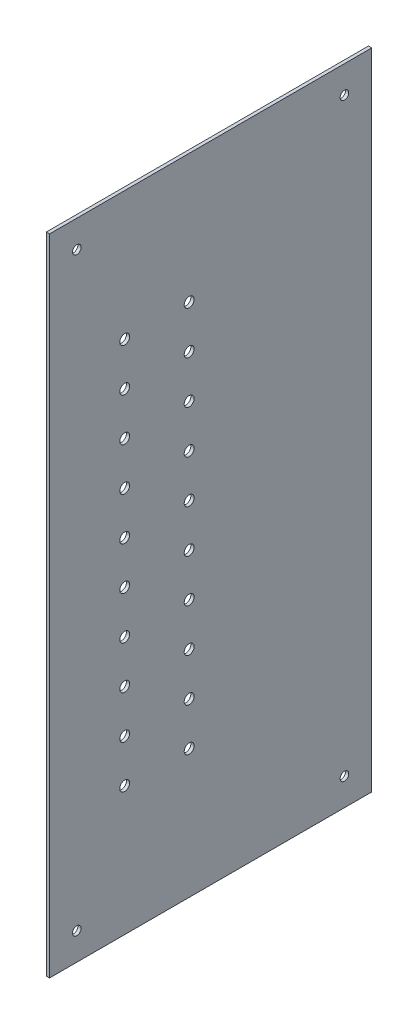
ISO-10303-21;
HEADER;
FILE_DESCRIPTION(('STEP AP214'),'2;1');
FILE_NAME('part.step','',(''),(''),'','','');
FILE_SCHEMA(('AUTOMOTIVE_DESIGN { 1 0 10303 214 1 1 1 1 }'));
ENDSEC;
DATA;
#1=APPLICATION_CONTEXT('core data for automotive mechanical design processes');
#2=APPLICATION_PROTOCOL_DEFINITION('international standard','automotive_design',2000,#1);
#3=PRODUCT_CONTEXT('',#1,'mechanical');
#4=PRODUCT('Part','Part','',(#3));
#5=PRODUCT_RELATED_PRODUCT_CATEGORY('part','',(#4));
#6=PRODUCT_DEFINITION_FORMATION('','',#4);
#7=PRODUCT_DEFINITION_CONTEXT('part definition',#1,'design');
#8=PRODUCT_DEFINITION('design','',#6,#7);
#9=PRODUCT_DEFINITION_SHAPE('','',#8);
#10=(LENGTH_UNIT() NAMED_UNIT(*) SI_UNIT(.MILLI.,.METRE.));
#11=(NAMED_UNIT(*) PLANE_ANGLE_UNIT() SI_UNIT($,.RADIAN.));
#12=(NAMED_UNIT(*) SI_UNIT($,.STERADIAN.) SOLID_ANGLE_UNIT());
#13=UNCERTAINTY_MEASURE_WITH_UNIT(LENGTH_MEASURE(1.E-05),#10,'distance_accuracy_value','');
#14=(GEOMETRIC_REPRESENTATION_CONTEXT(3) GLOBAL_UNCERTAINTY_ASSIGNED_CONTEXT((#13)) GLOBAL_UNIT_ASSIGNED_CONTEXT((#10,
#11,#12)) REPRESENTATION_CONTEXT('',''));
#15=CARTESIAN_POINT('',(0.,0.,0.));
#16=DIRECTION('',(0.,0.,1.));
#17=DIRECTION('',(1.,0.,0.));
#18=AXIS2_PLACEMENT_3D('',#15,#16,#17);
#19=CARTESIAN_POINT('',(0.,0.,0.));
#20=DIRECTION('',(-1.,0.,0.));
#21=DIRECTION('',(0.,0.,1.));
#22=AXIS2_PLACEMENT_3D('',#19,#20,#21);
#23=PLANE('',#22);
#24=CARTESIAN_POINT('',(0.,-90.,9.99999999999999));
#25=DIRECTION('',(1.,0.,0.));
#26=DIRECTION('',(0.,0.,-1.));
#27=AXIS2_PLACEMENT_3D('',#24,#25,#26);
#28=CIRCLE('',#27,2.29999999999998);
#29=CARTESIAN_POINT('',(0.,-90.,7.70000000000001));
#30=VERTEX_POINT('',#29);
#31=EDGE_CURVE('E1882',#30,#30,#28,.T.);
#32=ORIENTED_EDGE('',*,*,#31,.T.);
#33=EDGE_LOOP('',(#32));
#34=FACE_BOUND('',#33,.T.);
#35=CARTESIAN_POINT('',(0.,-70.,10.));
#36=DIRECTION('',(1.,0.,0.));
#37=DIRECTION('',(0.,0.,-1.));
#38=AXIS2_PLACEMENT_3D('',#35,#36,#37);
#39=CIRCLE('',#38,2.29999999999998);
#40=CARTESIAN_POINT('',(0.,-70.,7.70000000000002));
#41=VERTEX_POINT('',#40);
#42=EDGE_CURVE('E1880',#41,#41,#39,.T.);
#43=ORIENTED_EDGE('',*,*,#42,.T.);
#44=EDGE_LOOP('',(#43));
#45=FACE_BOUND('',#44,.T.);
#46=CARTESIAN_POINT('',(0.,-50.,10.));
#47=DIRECTION('',(1.,0.,0.));
#48=DIRECTION('',(0.,0.,-1.));
#49=AXIS2_PLACEMENT_3D('',#46,#47,#48);
#50=CIRCLE('',#49,2.29999999999999);
#51=CARTESIAN_POINT('',(0.,-50.,7.70000000000001));
#52=VERTEX_POINT('',#51);
#53=EDGE_CURVE('E1868',#52,#52,#50,.T.);
#54=ORIENTED_EDGE('',*,*,#53,.T.);
#55=EDGE_LOOP('',(#54));
#56=FACE_BOUND('',#55,.T.);
#57=CARTESIAN_POINT('',(0.,-30.,10.));
#58=DIRECTION('',(1.,0.,0.));
#59=DIRECTION('',(0.,0.,-1.));
#60=AXIS2_PLACEMENT_3D('',#57,#58,#59);
#61=CIRCLE('',#60,2.29999999999999);
#62=CARTESIAN_POINT('',(0.,-30.,7.70000000000002));
#63=VERTEX_POINT('',#62);
#64=EDGE_CURVE('E1861',#63,#63,#61,.T.);
#65=ORIENTED_EDGE('',*,*,#64,.T.);
#66=EDGE_LOOP('',(#65));
#67=FACE_BOUND('',#66,.T.);
#68=CARTESIAN_POINT('',(0.,-9.99999999999999,10.));
#69=DIRECTION('',(1.,0.,0.));
#70=DIRECTION('',(0.,0.,-1.));
#71=AXIS2_PLACEMENT_3D('',#68,#69,#70);
#72=CIRCLE('',#71,2.29999999999999);
#73=CARTESIAN_POINT('',(0.,-9.99999999999999,7.70000000000001));
#74=VERTEX_POINT('',#73);
#75=EDGE_CURVE('E1851',#74,#74,#72,.T.);
#76=ORIENTED_EDGE('',*,*,#75,.T.);
#77=EDGE_LOOP('',(#76));
#78=FACE_BOUND('',#77,.T.);
#79=CARTESIAN_POINT('',(0.,10.,10.));
#80=DIRECTION('',(1.,0.,0.));
#81=DIRECTION('',(0.,0.,-1.));
#82=AXIS2_PLACEMENT_3D('',#79,#80,#81);
#83=CIRCLE('',#82,2.29999999999999);
#84=CARTESIAN_POINT('',(0.,10.,7.70000000000001));
#85=VERTEX_POINT('',#84);
#86=EDGE_CURVE('E1842',#85,#85,#83,.T.);
#87=ORIENTED_EDGE('',*,*,#86,.T.);
#88=EDGE_LOOP('',(#87));
#89=FACE_BOUND('',#88,.T.);
#90=CARTESIAN_POINT('',(0.,30.,10.));
#91=DIRECTION('',(1.,0.,0.));
#92=DIRECTION('',(0.,0.,-1.));
#93=AXIS2_PLACEMENT_3D('',#90,#91,#92);
#94=CIRCLE('',#93,2.29999999999999);
#95=CARTESIAN_POINT('',(0.,30.,7.70000000000001));
#96=VERTEX_POINT('',#95);
#97=EDGE_CURVE('E1840',#96,#96,#94,.T.);
#98=ORIENTED_EDGE('',*,*,#97,.T.);
#99=EDGE_LOOP('',(#98));
#100=FACE_BOUND('',#99,.T.);
#101=CARTESIAN_POINT('',(0.,50.,10.));
#102=DIRECTION('',(1.,0.,0.));
#103=DIRECTION('',(0.,0.,-1.));
#104=AXIS2_PLACEMENT_3D('',#101,#102,#103);
#105=CIRCLE('',#104,2.29999999999999);
#106=CARTESIAN_POINT('',(0.,50.,7.70000000000001));
#107=VERTEX_POINT('',#106);
#108=EDGE_CURVE('E1828',#107,#107,#105,.T.);
#109=ORIENTED_EDGE('',*,*,#108,.T.);
#110=EDGE_LOOP('',(#109));
#111=FACE_BOUND('',#110,.T.);
#112=CARTESIAN_POINT('',(0.,70.,10.));
#113=DIRECTION('',(1.,0.,0.));
#114=DIRECTION('',(0.,0.,-1.));
#115=AXIS2_PLACEMENT_3D('',#112,#113,#114);
#116=CIRCLE('',#115,2.29999999999998);
#117=CARTESIAN_POINT('',(0.,70.,7.70000000000002));
#118=VERTEX_POINT('',#117);
#119=EDGE_CURVE('E1823',#118,#118,#116,.T.);
#120=ORIENTED_EDGE('',*,*,#119,.T.);
#121=EDGE_LOOP('',(#120));
#122=FACE_BOUND('',#121,.T.);
#123=CARTESIAN_POINT('',(0.,90.,10.));
#124=DIRECTION('',(1.,0.,0.));
#125=DIRECTION('',(0.,0.,-1.));
#126=AXIS2_PLACEMENT_3D('',#123,#124,#125);
#127=CIRCLE('',#126,2.29999999999998);
#128=CARTESIAN_POINT('',(0.,90.,7.70000000000002));
#129=VERTEX_POINT('',#128);
#130=EDGE_CURVE('E1812',#129,#129,#127,.T.);
#131=ORIENTED_EDGE('',*,*,#130,.T.);
#132=EDGE_LOOP('',(#131));
#133=FACE_BOUND('',#132,.T.);
#134=CARTESIAN_POINT('',(0.,-90.,40.));
#135=DIRECTION('',(1.,0.,0.));
#136=DIRECTION('',(0.,0.,-1.));
#137=AXIS2_PLACEMENT_3D('',#134,#135,#136);
#138=CIRCLE('',#137,2.3);
#139=CARTESIAN_POINT('',(0.,-90.,37.7));
#140=VERTEX_POINT('',#139);
#141=EDGE_CURVE('E1804',#140,#140,#138,.T.);
#142=ORIENTED_EDGE('',*,*,#141,.T.);
#143=EDGE_LOOP('',(#142));
#144=FACE_BOUND('',#143,.T.);
#145=CARTESIAN_POINT('',(0.,137.3,-62.3));
#146=DIRECTION('',(1.,0.,0.));
#147=DIRECTION('',(0.,0.,-1.));
#148=AXIS2_PLACEMENT_3D('',#145,#146,#147);
#149=CIRCLE('',#148,2.);
#150=CARTESIAN_POINT('',(0.,137.3,-64.3));
#151=VERTEX_POINT('',#150);
#152=EDGE_CURVE('E1723',#151,#151,#149,.T.);
#153=ORIENTED_EDGE('',*,*,#152,.T.);
#154=EDGE_LOOP('',(#153));
#155=FACE_BOUND('',#154,.T.);
#156=CARTESIAN_POINT('',(0.,137.3,62.3));
#157=DIRECTION('',(1.,0.,0.));
#158=DIRECTION('',(0.,0.,-1.));
#159=AXIS2_PLACEMENT_3D('',#156,#157,#158);
#160=CIRCLE('',#159,2.);
#161=CARTESIAN_POINT('',(0.,137.3,60.3));
#162=VERTEX_POINT('',#161);
#163=EDGE_CURVE('E1716',#162,#162,#160,.T.);
#164=ORIENTED_EDGE('',*,*,#163,.T.);
#165=EDGE_LOOP('',(#164));
#166=FACE_BOUND('',#165,.T.);
#167=DIRECTION('',(0.,0.,1.));
#168=VECTOR('',#167,1.);
#169=CARTESIAN_POINT('',(0.,150.,-75.));
#170=LINE('',#169,#168);
#171=CARTESIAN_POINT('',(0.,150.,-75.));
#172=VERTEX_POINT('',#171);
#173=CARTESIAN_POINT('',(0.,150.,75.));
#174=VERTEX_POINT('',#173);
#175=EDGE_CURVE('E1676',#172,#174,#170,.T.);
#176=ORIENTED_EDGE('',*,*,#175,.F.);
#177=DIRECTION('',(0.,1.,0.));
#178=VECTOR('',#177,1.);
#179=CARTESIAN_POINT('',(0.,-150.,-75.));
#180=LINE('',#179,#178);
#181=CARTESIAN_POINT('',(0.,-150.,-75.));
#182=VERTEX_POINT('',#181);
#183=EDGE_CURVE('E1646',#182,#172,#180,.T.);
#184=ORIENTED_EDGE('',*,*,#183,.F.);
#185=DIRECTION('',(0.,0.,-1.));
#186=VECTOR('',#185,1.);
#187=CARTESIAN_POINT('',(0.,-150.,-75.));
#188=LINE('',#187,#186);
#189=CARTESIAN_POINT('',(0.,-150.,75.));
#190=VERTEX_POINT('',#189);
#191=EDGE_CURVE('E1639',#190,#182,#188,.T.);
#192=ORIENTED_EDGE('',*,*,#191,.F.);
#193=DIRECTION('',(0.,-1.,0.));
#194=VECTOR('',#193,1.);
#195=CARTESIAN_POINT('',(0.,-150.,75.));
#196=LINE('',#195,#194);
#197=EDGE_CURVE('E1663',#174,#190,#196,.T.);
#198=ORIENTED_EDGE('',*,*,#197,.F.);
#199=EDGE_LOOP('',(#176,#184,#192,#198));
#200=FACE_BOUND('',#199,.T.);
#201=CARTESIAN_POINT('',(0.,-137.3,62.3));
#202=DIRECTION('',(1.,0.,0.));
#203=DIRECTION('',(0.,0.,-1.));
#204=AXIS2_PLACEMENT_3D('',#201,#202,#203);
#205=CIRCLE('',#204,2.);
#206=CARTESIAN_POINT('',(0.,-137.3,60.3));
#207=VERTEX_POINT('',#206);
#208=EDGE_CURVE('E1683',#207,#207,#205,.T.);
#209=ORIENTED_EDGE('',*,*,#208,.T.);
#210=EDGE_LOOP('',(#209));
#211=FACE_BOUND('',#210,.T.);
#212=CARTESIAN_POINT('',(0.,-137.3,-62.3));
#213=DIRECTION('',(1.,0.,0.));
#214=DIRECTION('',(0.,0.,-1.));
#215=AXIS2_PLACEMENT_3D('',#212,#213,#214);
#216=CIRCLE('',#215,2.);
#217=CARTESIAN_POINT('',(0.,-137.3,-64.3));
#218=VERTEX_POINT('',#217);
#219=EDGE_CURVE('E1706',#218,#218,#216,.T.);
#220=ORIENTED_EDGE('',*,*,#219,.T.);
#221=EDGE_LOOP('',(#220));
#222=FACE_BOUND('',#221,.T.);
#223=CARTESIAN_POINT('',(0.,90.,40.));
#224=DIRECTION('',(1.,0.,0.));
#225=DIRECTION('',(0.,0.,-1.));
#226=AXIS2_PLACEMENT_3D('',#223,#224,#225);
#227=CIRCLE('',#226,2.3);
#228=CARTESIAN_POINT('',(0.,90.,37.7));
#229=VERTEX_POINT('',#228);
#230=EDGE_CURVE('E1735',#229,#229,#227,.T.);
#231=ORIENTED_EDGE('',*,*,#230,.T.);
#232=EDGE_LOOP('',(#231));
#233=FACE_BOUND('',#232,.T.);
#234=CARTESIAN_POINT('',(0.,70.,40.));
#235=DIRECTION('',(1.,0.,0.));
#236=DIRECTION('',(0.,0.,-1.));
#237=AXIS2_PLACEMENT_3D('',#234,#235,#236);
#238=CIRCLE('',#237,2.3);
#239=CARTESIAN_POINT('',(0.,70.,37.7));
#240=VERTEX_POINT('',#239);
#241=EDGE_CURVE('E1743',#240,#240,#238,.T.);
#242=ORIENTED_EDGE('',*,*,#241,.T.);
#243=EDGE_LOOP('',(#242));
#244=FACE_BOUND('',#243,.T.);
#245=CARTESIAN_POINT('',(0.,50.,40.));
#246=DIRECTION('',(1.,0.,0.));
#247=DIRECTION('',(0.,0.,-1.));
#248=AXIS2_PLACEMENT_3D('',#245,#246,#247);
#249=CIRCLE('',#248,2.3);
#250=CARTESIAN_POINT('',(0.,50.,37.7));
#251=VERTEX_POINT('',#250);
#252=EDGE_CURVE('E1747',#251,#251,#249,.T.);
#253=ORIENTED_EDGE('',*,*,#252,.T.);
#254=EDGE_LOOP('',(#253));
#255=FACE_BOUND('',#254,.T.);
#256=CARTESIAN_POINT('',(0.,30.,40.));
#257=DIRECTION('',(1.,0.,0.));
#258=DIRECTION('',(0.,0.,-1.));
#259=AXIS2_PLACEMENT_3D('',#256,#257,#258);
#260=CIRCLE('',#259,2.3);
#261=CARTESIAN_POINT('',(0.,30.,37.7));
#262=VERTEX_POINT('',#261);
#263=EDGE_CURVE('E1760',#262,#262,#260,.T.);
#264=ORIENTED_EDGE('',*,*,#263,.T.);
#265=EDGE_LOOP('',(#264));
#266=FACE_BOUND('',#265,.T.);
#267=CARTESIAN_POINT('',(0.,10.,40.));
#268=DIRECTION('',(1.,0.,0.));
#269=DIRECTION('',(0.,0.,-1.));
#270=AXIS2_PLACEMENT_3D('',#267,#268,#269);
#271=CIRCLE('',#270,2.3);
#272=CARTESIAN_POINT('',(0.,10.,37.7));
#273=VERTEX_POINT('',#272);
#274=EDGE_CURVE('E1763',#273,#273,#271,.T.);
#275=ORIENTED_EDGE('',*,*,#274,.T.);
#276=EDGE_LOOP('',(#275));
#277=FACE_BOUND('',#276,.T.);
#278=CARTESIAN_POINT('',(0.,-10.,40.));
#279=DIRECTION('',(1.,0.,0.));
#280=DIRECTION('',(0.,0.,-1.));
#281=AXIS2_PLACEMENT_3D('',#278,#279,#280);
#282=CIRCLE('',#281,2.3);
#283=CARTESIAN_POINT('',(0.,-10.,37.7));
#284=VERTEX_POINT('',#283);
#285=EDGE_CURVE('E1775',#284,#284,#282,.T.);
#286=ORIENTED_EDGE('',*,*,#285,.T.);
#287=EDGE_LOOP('',(#286));
#288=FACE_BOUND('',#287,.T.);
#289=CARTESIAN_POINT('',(0.,-30.,40.));
#290=DIRECTION('',(1.,0.,0.));
#291=DIRECTION('',(0.,0.,-1.));
#292=AXIS2_PLACEMENT_3D('',#289,#290,#291);
#293=CIRCLE('',#292,2.3);
#294=CARTESIAN_POINT('',(0.,-30.,37.7));
#295=VERTEX_POINT('',#294);
#296=EDGE_CURVE('E1783',#295,#295,#293,.T.);
#297=ORIENTED_EDGE('',*,*,#296,.T.);
#298=EDGE_LOOP('',(#297));
#299=FACE_BOUND('',#298,.T.);
#300=CARTESIAN_POINT('',(0.,-50.,40.));
#301=DIRECTION('',(1.,0.,0.));
#302=DIRECTION('',(0.,0.,-1.));
#303=AXIS2_PLACEMENT_3D('',#300,#301,#302);
#304=CIRCLE('',#303,2.3);
#305=CARTESIAN_POINT('',(0.,-50.,37.7));
#306=VERTEX_POINT('',#305);
#307=EDGE_CURVE('E1788',#306,#306,#304,.T.);
#308=ORIENTED_EDGE('',*,*,#307,.T.);
#309=EDGE_LOOP('',(#308));
#310=FACE_BOUND('',#309,.T.);
#311=CARTESIAN_POINT('',(0.,-70.,40.));
#312=DIRECTION('',(1.,0.,0.));
#313=DIRECTION('',(0.,0.,-1.));
#314=AXIS2_PLACEMENT_3D('',#311,#312,#313);
#315=CIRCLE('',#314,2.3);
#316=CARTESIAN_POINT('',(0.,-70.,37.7));
#317=VERTEX_POINT('',#316);
#318=EDGE_CURVE('E1800',#317,#317,#315,.T.);
#319=ORIENTED_EDGE('',*,*,#318,.T.);
#320=EDGE_LOOP('',(#319));
#321=FACE_BOUND('',#320,.T.);
#322=ADVANCED_FACE('F1602',(#34,#45,#56,#67,#78,#89,#100,#111,#122,#133,#144,#155,#166,#200,
#211,#222,#233,#244,#255,#266,#277,#288,#299,#310,#321),#23,.T.);
#323=CARTESIAN_POINT('',(1.52,0.,0.));
#324=DIRECTION('',(-1.,0.,0.));
#325=DIRECTION('',(0.,0.,1.));
#326=AXIS2_PLACEMENT_3D('',#323,#324,#325);
#327=PLANE('',#326);
#328=CARTESIAN_POINT('',(1.52,-90.,9.99999999999999));
#329=DIRECTION('',(1.,0.,0.));
#330=DIRECTION('',(0.,0.,-1.));
#331=AXIS2_PLACEMENT_3D('',#328,#329,#330);
#332=CIRCLE('',#331,2.29999999999998);
#333=CARTESIAN_POINT('',(1.52,-90.,7.70000000000001));
#334=VERTEX_POINT('',#333);
#335=EDGE_CURVE('E1889',#334,#334,#332,.T.);
#336=ORIENTED_EDGE('',*,*,#335,.F.);
#337=EDGE_LOOP('',(#336));
#338=FACE_BOUND('',#337,.T.);
#339=CARTESIAN_POINT('',(1.52,-70.,10.));
#340=DIRECTION('',(1.,0.,0.));
#341=DIRECTION('',(0.,0.,-1.));
#342=AXIS2_PLACEMENT_3D('',#339,#340,#341);
#343=CIRCLE('',#342,2.29999999999998);
#344=CARTESIAN_POINT('',(1.52,-70.,7.70000000000002));
#345=VERTEX_POINT('',#344);
#346=EDGE_CURVE('E1884',#345,#345,#343,.T.);
#347=ORIENTED_EDGE('',*,*,#346,.F.);
#348=EDGE_LOOP('',(#347));
#349=FACE_BOUND('',#348,.T.);
#350=CARTESIAN_POINT('',(1.52,-50.,10.));
#351=DIRECTION('',(1.,0.,0.));
#352=DIRECTION('',(0.,0.,-1.));
#353=AXIS2_PLACEMENT_3D('',#350,#351,#352);
#354=CIRCLE('',#353,2.29999999999999);
#355=CARTESIAN_POINT('',(1.52,-50.,7.70000000000001));
#356=VERTEX_POINT('',#355);
#357=EDGE_CURVE('E1874',#356,#356,#354,.T.);
#358=ORIENTED_EDGE('',*,*,#357,.F.);
#359=EDGE_LOOP('',(#358));
#360=FACE_BOUND('',#359,.T.);
#361=CARTESIAN_POINT('',(1.52,-30.,10.));
#362=DIRECTION('',(1.,0.,0.));
#363=DIRECTION('',(0.,0.,-1.));
#364=AXIS2_PLACEMENT_3D('',#361,#362,#363);
#365=CIRCLE('',#364,2.29999999999999);
#366=CARTESIAN_POINT('',(1.52,-30.,7.70000000000002));
#367=VERTEX_POINT('',#366);
#368=EDGE_CURVE('E1864',#367,#367,#365,.T.);
#369=ORIENTED_EDGE('',*,*,#368,.F.);
#370=EDGE_LOOP('',(#369));
#371=FACE_BOUND('',#370,.T.);
#372=CARTESIAN_POINT('',(1.52,-9.99999999999999,10.));
#373=DIRECTION('',(1.,0.,0.));
#374=DIRECTION('',(0.,0.,-1.));
#375=AXIS2_PLACEMENT_3D('',#372,#373,#374);
#376=CIRCLE('',#375,2.29999999999999);
#377=CARTESIAN_POINT('',(1.52,-9.99999999999999,7.70000000000001));
#378=VERTEX_POINT('',#377);
#379=EDGE_CURVE('E1860',#378,#378,#376,.T.);
#380=ORIENTED_EDGE('',*,*,#379,.F.);
#381=EDGE_LOOP('',(#380));
#382=FACE_BOUND('',#381,.T.);
#383=CARTESIAN_POINT('',(1.52,10.,10.));
#384=DIRECTION('',(1.,0.,0.));
#385=DIRECTION('',(0.,0.,-1.));
#386=AXIS2_PLACEMENT_3D('',#383,#384,#385);
#387=CIRCLE('',#386,2.29999999999999);
#388=CARTESIAN_POINT('',(1.52,10.,7.70000000000001));
#389=VERTEX_POINT('',#388);
#390=EDGE_CURVE('E1850',#389,#389,#387,.T.);
#391=ORIENTED_EDGE('',*,*,#390,.F.);
#392=EDGE_LOOP('',(#391));
#393=FACE_BOUND('',#392,.T.);
#394=CARTESIAN_POINT('',(1.52,30.,10.));
#395=DIRECTION('',(1.,0.,0.));
#396=DIRECTION('',(0.,0.,-1.));
#397=AXIS2_PLACEMENT_3D('',#394,#395,#396);
#398=CIRCLE('',#397,2.29999999999999);
#399=CARTESIAN_POINT('',(1.52,30.,7.70000000000001));
#400=VERTEX_POINT('',#399);
#401=EDGE_CURVE('E1844',#400,#400,#398,.T.);
#402=ORIENTED_EDGE('',*,*,#401,.F.);
#403=EDGE_LOOP('',(#402));
#404=FACE_BOUND('',#403,.T.);
#405=CARTESIAN_POINT('',(1.52,50.,10.));
#406=DIRECTION('',(1.,0.,0.));
#407=DIRECTION('',(0.,0.,-1.));
#408=AXIS2_PLACEMENT_3D('',#405,#406,#407);
#409=CIRCLE('',#408,2.29999999999999);
#410=CARTESIAN_POINT('',(1.52,50.,7.70000000000001));
#411=VERTEX_POINT('',#410);
#412=EDGE_CURVE('E1831',#411,#411,#409,.T.);
#413=ORIENTED_EDGE('',*,*,#412,.F.);
#414=EDGE_LOOP('',(#413));
#415=FACE_BOUND('',#414,.T.);
#416=CARTESIAN_POINT('',(1.52,70.,10.));
#417=DIRECTION('',(1.,0.,0.));
#418=DIRECTION('',(0.,0.,-1.));
#419=AXIS2_PLACEMENT_3D('',#416,#417,#418);
#420=CIRCLE('',#419,2.29999999999998);
#421=CARTESIAN_POINT('',(1.52,70.,7.70000000000002));
#422=VERTEX_POINT('',#421);
#423=EDGE_CURVE('E1822',#422,#422,#420,.T.);
#424=ORIENTED_EDGE('',*,*,#423,.F.);
#425=EDGE_LOOP('',(#424));
#426=FACE_BOUND('',#425,.T.);
#427=CARTESIAN_POINT('',(1.52,90.,10.));
#428=DIRECTION('',(1.,0.,0.));
#429=DIRECTION('',(0.,0.,-1.));
#430=AXIS2_PLACEMENT_3D('',#427,#428,#429);
#431=CIRCLE('',#430,2.29999999999998);
#432=CARTESIAN_POINT('',(1.52,90.,7.70000000000002));
#433=VERTEX_POINT('',#432);
#434=EDGE_CURVE('E1820',#433,#433,#431,.T.);
#435=ORIENTED_EDGE('',*,*,#434,.F.);
#436=EDGE_LOOP('',(#435));
#437=FACE_BOUND('',#436,.T.);
#438=CARTESIAN_POINT('',(1.52,-90.,40.));
#439=DIRECTION('',(1.,0.,0.));
#440=DIRECTION('',(0.,0.,-1.));
#441=AXIS2_PLACEMENT_3D('',#438,#439,#440);
#442=CIRCLE('',#441,2.3);
#443=CARTESIAN_POINT('',(1.52,-90.,37.7));
#444=VERTEX_POINT('',#443);
#445=EDGE_CURVE('E1807',#444,#444,#442,.T.);
#446=ORIENTED_EDGE('',*,*,#445,.F.);
#447=EDGE_LOOP('',(#446));
#448=FACE_BOUND('',#447,.T.);
#449=CARTESIAN_POINT('',(1.52,-70.,40.));
#450=DIRECTION('',(1.,0.,0.));
#451=DIRECTION('',(0.,0.,-1.));
#452=AXIS2_PLACEMENT_3D('',#449,#450,#451);
#453=CIRCLE('',#452,2.3);
#454=CARTESIAN_POINT('',(1.52,-70.,37.7));
#455=VERTEX_POINT('',#454);
#456=EDGE_CURVE('E1801',#455,#455,#453,.T.);
#457=ORIENTED_EDGE('',*,*,#456,.F.);
#458=EDGE_LOOP('',(#457));
#459=FACE_BOUND('',#458,.T.);
#460=CARTESIAN_POINT('',(1.52,-50.,40.));
#461=DIRECTION('',(1.,0.,0.));
#462=DIRECTION('',(0.,0.,-1.));
#463=AXIS2_PLACEMENT_3D('',#460,#461,#462);
#464=CIRCLE('',#463,2.3);
#465=CARTESIAN_POINT('',(1.52,-50.,37.7));
#466=VERTEX_POINT('',#465);
#467=EDGE_CURVE('E1791',#466,#466,#464,.T.);
#468=ORIENTED_EDGE('',*,*,#467,.F.);
#469=EDGE_LOOP('',(#468));
#470=FACE_BOUND('',#469,.T.);
#471=CARTESIAN_POINT('',(1.52,-30.,40.));
#472=DIRECTION('',(1.,0.,0.));
#473=DIRECTION('',(0.,0.,-1.));
#474=AXIS2_PLACEMENT_3D('',#471,#472,#473);
#475=CIRCLE('',#474,2.3);
#476=CARTESIAN_POINT('',(1.52,-30.,37.7));
#477=VERTEX_POINT('',#476);
#478=EDGE_CURVE('E1782',#477,#477,#475,.T.);
#479=ORIENTED_EDGE('',*,*,#478,.F.);
#480=EDGE_LOOP('',(#479));
#481=FACE_BOUND('',#480,.T.);
#482=CARTESIAN_POINT('',(1.52,-10.,40.));
#483=DIRECTION('',(1.,0.,0.));
#484=DIRECTION('',(0.,0.,-1.));
#485=AXIS2_PLACEMENT_3D('',#482,#483,#484);
#486=CIRCLE('',#485,2.3);
#487=CARTESIAN_POINT('',(1.52,-10.,37.7));
#488=VERTEX_POINT('',#487);
#489=EDGE_CURVE('E1780',#488,#488,#486,.T.);
#490=ORIENTED_EDGE('',*,*,#489,.F.);
#491=EDGE_LOOP('',(#490));
#492=FACE_BOUND('',#491,.T.);
#493=CARTESIAN_POINT('',(1.52,30.,40.));
#494=DIRECTION('',(1.,0.,0.));
#495=DIRECTION('',(0.,0.,-1.));
#496=AXIS2_PLACEMENT_3D('',#493,#494,#495);
#497=CIRCLE('',#496,2.3);
#498=CARTESIAN_POINT('',(1.52,30.,37.7));
#499=VERTEX_POINT('',#498);
#500=EDGE_CURVE('E1762',#499,#499,#497,.T.);
#501=ORIENTED_EDGE('',*,*,#500,.F.);
#502=EDGE_LOOP('',(#501));
#503=FACE_BOUND('',#502,.T.);
#504=CARTESIAN_POINT('',(1.52,50.,40.));
#505=DIRECTION('',(1.,0.,0.));
#506=DIRECTION('',(0.,0.,-1.));
#507=AXIS2_PLACEMENT_3D('',#504,#505,#506);
#508=CIRCLE('',#507,2.3);
#509=CARTESIAN_POINT('',(1.52,50.,37.7));
#510=VERTEX_POINT('',#509);
#511=EDGE_CURVE('E1753',#510,#510,#508,.T.);
#512=ORIENTED_EDGE('',*,*,#511,.F.);
#513=EDGE_LOOP('',(#512));
#514=FACE_BOUND('',#513,.T.);
#515=CARTESIAN_POINT('',(1.52,70.,40.));
#516=DIRECTION('',(1.,0.,0.));
#517=DIRECTION('',(0.,0.,-1.));
#518=AXIS2_PLACEMENT_3D('',#515,#516,#517);
#519=CIRCLE('',#518,2.3);
#520=CARTESIAN_POINT('',(1.52,70.,37.7));
#521=VERTEX_POINT('',#520);
#522=EDGE_CURVE('E1742',#521,#521,#519,.T.);
#523=ORIENTED_EDGE('',*,*,#522,.F.);
#524=EDGE_LOOP('',(#523));
#525=FACE_BOUND('',#524,.T.);
#526=CARTESIAN_POINT('',(1.52,90.,40.));
#527=DIRECTION('',(1.,0.,0.));
#528=DIRECTION('',(0.,0.,-1.));
#529=AXIS2_PLACEMENT_3D('',#526,#527,#528);
#530=CIRCLE('',#529,2.3);
#531=CARTESIAN_POINT('',(1.52,90.,37.7));
#532=VERTEX_POINT('',#531);
#533=EDGE_CURVE('E1737',#532,#532,#530,.T.);
#534=ORIENTED_EDGE('',*,*,#533,.F.);
#535=EDGE_LOOP('',(#534));
#536=FACE_BOUND('',#535,.T.);
#537=CARTESIAN_POINT('',(1.52,137.3,-62.3));
#538=DIRECTION('',(1.,0.,0.));
#539=DIRECTION('',(0.,0.,-1.));
#540=AXIS2_PLACEMENT_3D('',#537,#538,#539);
#541=CIRCLE('',#540,2.);
#542=CARTESIAN_POINT('',(1.52,137.3,-64.3));
#543=VERTEX_POINT('',#542);
#544=EDGE_CURVE('E1729',#543,#543,#541,.T.);
#545=ORIENTED_EDGE('',*,*,#544,.F.);
#546=EDGE_LOOP('',(#545));
#547=FACE_BOUND('',#546,.T.);
#548=CARTESIAN_POINT('',(1.52,-137.3,-62.3));
#549=DIRECTION('',(1.,0.,0.));
#550=DIRECTION('',(0.,0.,-1.));
#551=AXIS2_PLACEMENT_3D('',#548,#549,#550);
#552=CIRCLE('',#551,2.);
#553=CARTESIAN_POINT('',(1.52,-137.3,-64.3));
#554=VERTEX_POINT('',#553);
#555=EDGE_CURVE('E1711',#554,#554,#552,.T.);
#556=ORIENTED_EDGE('',*,*,#555,.F.);
#557=EDGE_LOOP('',(#556));
#558=FACE_BOUND('',#557,.T.);
#559=CARTESIAN_POINT('',(1.52,-137.3,62.3));
#560=DIRECTION('',(1.,0.,0.));
#561=DIRECTION('',(0.,0.,-1.));
#562=AXIS2_PLACEMENT_3D('',#559,#560,#561);
#563=CIRCLE('',#562,2.);
#564=CARTESIAN_POINT('',(1.52,-137.3,60.3));
#565=VERTEX_POINT('',#564);
#566=EDGE_CURVE('E1704',#565,#565,#563,.T.);
#567=ORIENTED_EDGE('',*,*,#566,.F.);
#568=EDGE_LOOP('',(#567));
#569=FACE_BOUND('',#568,.T.);
#570=DIRECTION('',(0.,0.,1.));
#571=VECTOR('',#570,1.);
#572=CARTESIAN_POINT('',(1.52,150.,-75.));
#573=LINE('',#572,#571);
#574=CARTESIAN_POINT('',(1.52,150.,-75.));
#575=VERTEX_POINT('',#574);
#576=CARTESIAN_POINT('',(1.52,150.,75.));
#577=VERTEX_POINT('',#576);
#578=EDGE_CURVE('E1659',#575,#577,#573,.T.);
#579=ORIENTED_EDGE('',*,*,#578,.T.);
#580=DIRECTION('',(0.,-1.,0.));
#581=VECTOR('',#580,1.);
#582=CARTESIAN_POINT('',(1.52,-150.,75.));
#583=LINE('',#582,#581);
#584=CARTESIAN_POINT('',(1.52,-150.,75.));
#585=VERTEX_POINT('',#584);
#586=EDGE_CURVE('E1654',#577,#585,#583,.T.);
#587=ORIENTED_EDGE('',*,*,#586,.T.);
#588=DIRECTION('',(0.,0.,-1.));
#589=VECTOR('',#588,1.);
#590=CARTESIAN_POINT('',(1.52,-150.,-75.));
#591=LINE('',#590,#589);
#592=CARTESIAN_POINT('',(1.52,-150.,-75.));
#593=VERTEX_POINT('',#592);
#594=EDGE_CURVE('E1660',#585,#593,#591,.T.);
#595=ORIENTED_EDGE('',*,*,#594,.T.);
#596=DIRECTION('',(0.,1.,0.));
#597=VECTOR('',#596,1.);
#598=CARTESIAN_POINT('',(1.52,-150.,-75.));
#599=LINE('',#598,#597);
#600=EDGE_CURVE('E1625',#593,#575,#599,.T.);
#601=ORIENTED_EDGE('',*,*,#600,.T.);
#602=EDGE_LOOP('',(#579,#587,#595,#601));
#603=FACE_BOUND('',#602,.T.);
#604=CARTESIAN_POINT('',(1.52,137.3,62.3));
#605=DIRECTION('',(1.,0.,0.));
#606=DIRECTION('',(0.,0.,-1.));
#607=AXIS2_PLACEMENT_3D('',#604,#605,#606);
#608=CIRCLE('',#607,2.);
#609=CARTESIAN_POINT('',(1.52,137.3,60.3));
#610=VERTEX_POINT('',#609);
#611=EDGE_CURVE('E1722',#610,#610,#608,.T.);
#612=ORIENTED_EDGE('',*,*,#611,.F.);
#613=EDGE_LOOP('',(#612));
#614=FACE_BOUND('',#613,.T.);
#615=CARTESIAN_POINT('',(1.52,10.,40.));
#616=DIRECTION('',(1.,0.,0.));
#617=DIRECTION('',(0.,0.,-1.));
#618=AXIS2_PLACEMENT_3D('',#615,#616,#617);
#619=CIRCLE('',#618,2.3);
#620=CARTESIAN_POINT('',(1.52,10.,37.7));
#621=VERTEX_POINT('',#620);
#622=EDGE_CURVE('E1769',#621,#621,#619,.T.);
#623=ORIENTED_EDGE('',*,*,#622,.F.);
#624=EDGE_LOOP('',(#623));
#625=FACE_BOUND('',#624,.T.);
#626=ADVANCED_FACE('F1651',(#338,#349,#360,#371,#382,#393,#404,#415,#426,#437,#448,#459,#470,
#481,#492,#503,#514,#525,#536,#547,#558,#569,#603,#614,#625),#327,.F.);
#627=CARTESIAN_POINT('',(1.52,150.,-75.));
#628=DIRECTION('',(0.,-1.,0.));
#629=DIRECTION('',(0.,0.,-1.));
#630=AXIS2_PLACEMENT_3D('',#627,#628,#629);
#631=PLANE('',#630);
#632=ORIENTED_EDGE('',*,*,#175,.T.);
#633=DIRECTION('',(-1.,0.,0.));
#634=VECTOR('',#633,1.);
#635=CARTESIAN_POINT('',(1.52,150.,75.));
#636=LINE('',#635,#634);
#637=EDGE_CURVE('E12',#577,#174,#636,.T.);
#638=ORIENTED_EDGE('',*,*,#637,.F.);
#639=ORIENTED_EDGE('',*,*,#578,.F.);
#640=DIRECTION('',(-1.,0.,0.));
#641=VECTOR('',#640,1.);
#642=CARTESIAN_POINT('',(1.52,150.,-75.));
#643=LINE('',#642,#641);
#644=EDGE_CURVE('E1671',#575,#172,#643,.T.);
#645=ORIENTED_EDGE('',*,*,#644,.T.);
#646=EDGE_LOOP('',(#632,#638,#639,#645));
#647=FACE_BOUND('',#646,.T.);
#648=ADVANCED_FACE('F1606',(#647),#631,.F.);
#649=CARTESIAN_POINT('',(1.52,-150.,75.));
#650=DIRECTION('',(0.,0.,-1.));
#651=DIRECTION('',(-1.,0.,0.));
#652=AXIS2_PLACEMENT_3D('',#649,#650,#651);
#653=PLANE('',#652);
#654=ORIENTED_EDGE('',*,*,#197,.T.);
#655=DIRECTION('',(-1.,0.,0.));
#656=VECTOR('',#655,1.);
#657=CARTESIAN_POINT('',(1.52,-150.,75.));
#658=LINE('',#657,#656);
#659=EDGE_CURVE('E1613',#585,#190,#658,.T.);
#660=ORIENTED_EDGE('',*,*,#659,.F.);
#661=ORIENTED_EDGE('',*,*,#586,.F.);
#662=ORIENTED_EDGE('',*,*,#637,.T.);
#663=EDGE_LOOP('',(#654,#660,#661,#662));
#664=FACE_BOUND('',#663,.T.);
#665=ADVANCED_FACE('F1665',(#664),#653,.F.);
#666=CARTESIAN_POINT('',(1.52,-150.,-75.));
#667=DIRECTION('',(0.,1.,0.));
#668=DIRECTION('',(0.,0.,1.));
#669=AXIS2_PLACEMENT_3D('',#666,#667,#668);
#670=PLANE('',#669);
#671=ORIENTED_EDGE('',*,*,#191,.T.);
#672=DIRECTION('',(-1.,0.,0.));
#673=VECTOR('',#672,1.);
#674=CARTESIAN_POINT('',(1.52,-150.,-75.));
#675=LINE('',#674,#673);
#676=EDGE_CURVE('E1667',#593,#182,#675,.T.);
#677=ORIENTED_EDGE('',*,*,#676,.F.);
#678=ORIENTED_EDGE('',*,*,#594,.F.);
#679=ORIENTED_EDGE('',*,*,#659,.T.);
#680=EDGE_LOOP('',(#671,#677,#678,#679));
#681=FACE_BOUND('',#680,.T.);
#682=ADVANCED_FACE('F1670',(#681),#670,.F.);
#683=CARTESIAN_POINT('',(1.52,-150.,-75.));
#684=DIRECTION('',(0.,0.,1.));
#685=DIRECTION('',(1.,0.,0.));
#686=AXIS2_PLACEMENT_3D('',#683,#684,#685);
#687=PLANE('',#686);
#688=ORIENTED_EDGE('',*,*,#183,.T.);
#689=ORIENTED_EDGE('',*,*,#644,.F.);
#690=ORIENTED_EDGE('',*,*,#600,.F.);
#691=ORIENTED_EDGE('',*,*,#676,.T.);
#692=EDGE_LOOP('',(#688,#689,#690,#691));
#693=FACE_BOUND('',#692,.T.);
#694=ADVANCED_FACE('F1693',(#693),#687,.F.);
#695=CARTESIAN_POINT('',(1.52,-137.3,62.3));
#696=DIRECTION('',(1.,0.,0.));
#697=DIRECTION('',(0.,0.,-1.));
#698=AXIS2_PLACEMENT_3D('',#695,#696,#697);
#699=CYLINDRICAL_SURFACE('',#698,2.);
#700=ORIENTED_EDGE('',*,*,#208,.F.);
#701=EDGE_LOOP('',(#700));
#702=FACE_BOUND('',#701,.T.);
#703=ORIENTED_EDGE('',*,*,#566,.T.);
#704=EDGE_LOOP('',(#703));
#705=FACE_BOUND('',#704,.T.);
#706=ADVANCED_FACE('F1941',(#702,#705),#699,.F.);
#707=CARTESIAN_POINT('',(1.52,-137.3,-62.3));
#708=DIRECTION('',(1.,0.,0.));
#709=DIRECTION('',(0.,0.,-1.));
#710=AXIS2_PLACEMENT_3D('',#707,#708,#709);
#711=CYLINDRICAL_SURFACE('',#710,2.);
#712=ORIENTED_EDGE('',*,*,#219,.F.);
#713=EDGE_LOOP('',(#712));
#714=FACE_BOUND('',#713,.T.);
#715=ORIENTED_EDGE('',*,*,#555,.T.);
#716=EDGE_LOOP('',(#715));
#717=FACE_BOUND('',#716,.T.);
#718=ADVANCED_FACE('F1943',(#714,#717),#711,.F.);
#719=CARTESIAN_POINT('',(1.52,137.3,62.3));
#720=DIRECTION('',(1.,0.,0.));
#721=DIRECTION('',(0.,0.,-1.));
#722=AXIS2_PLACEMENT_3D('',#719,#720,#721);
#723=CYLINDRICAL_SURFACE('',#722,2.);
#724=ORIENTED_EDGE('',*,*,#163,.F.);
#725=EDGE_LOOP('',(#724));
#726=FACE_BOUND('',#725,.T.);
#727=ORIENTED_EDGE('',*,*,#611,.T.);
#728=EDGE_LOOP('',(#727));
#729=FACE_BOUND('',#728,.T.);
#730=ADVANCED_FACE('F1951',(#726,#729),#723,.F.);
#731=CARTESIAN_POINT('',(1.52,137.3,-62.3));
#732=DIRECTION('',(1.,0.,0.));
#733=DIRECTION('',(0.,0.,-1.));
#734=AXIS2_PLACEMENT_3D('',#731,#732,#733);
#735=CYLINDRICAL_SURFACE('',#734,2.);
#736=ORIENTED_EDGE('',*,*,#152,.F.);
#737=EDGE_LOOP('',(#736));
#738=FACE_BOUND('',#737,.T.);
#739=ORIENTED_EDGE('',*,*,#544,.T.);
#740=EDGE_LOOP('',(#739));
#741=FACE_BOUND('',#740,.T.);
#742=ADVANCED_FACE('F2010',(#738,#741),#735,.F.);
#743=CARTESIAN_POINT('',(1.52,90.,40.));
#744=DIRECTION('',(1.,0.,0.));
#745=DIRECTION('',(0.,0.,-1.));
#746=AXIS2_PLACEMENT_3D('',#743,#744,#745);
#747=CYLINDRICAL_SURFACE('',#746,2.3);
#748=ORIENTED_EDGE('',*,*,#230,.F.);
#749=EDGE_LOOP('',(#748));
#750=FACE_BOUND('',#749,.T.);
#751=ORIENTED_EDGE('',*,*,#533,.T.);
#752=EDGE_LOOP('',(#751));
#753=FACE_BOUND('',#752,.T.);
#754=ADVANCED_FACE('F2016',(#750,#753),#747,.F.);
#755=CARTESIAN_POINT('',(1.52,70.,40.));
#756=DIRECTION('',(1.,0.,0.));
#757=DIRECTION('',(0.,0.,-1.));
#758=AXIS2_PLACEMENT_3D('',#755,#756,#757);
#759=CYLINDRICAL_SURFACE('',#758,2.3);
#760=ORIENTED_EDGE('',*,*,#241,.F.);
#761=EDGE_LOOP('',(#760));
#762=FACE_BOUND('',#761,.T.);
#763=ORIENTED_EDGE('',*,*,#522,.T.);
#764=EDGE_LOOP('',(#763));
#765=FACE_BOUND('',#764,.T.);
#766=ADVANCED_FACE('F2036',(#762,#765),#759,.F.);
#767=CARTESIAN_POINT('',(1.52,50.,40.));
#768=DIRECTION('',(1.,0.,0.));
#769=DIRECTION('',(0.,0.,-1.));
#770=AXIS2_PLACEMENT_3D('',#767,#768,#769);
#771=CYLINDRICAL_SURFACE('',#770,2.3);
#772=ORIENTED_EDGE('',*,*,#252,.F.);
#773=EDGE_LOOP('',(#772));
#774=FACE_BOUND('',#773,.T.);
#775=ORIENTED_EDGE('',*,*,#511,.T.);
#776=EDGE_LOOP('',(#775));
#777=FACE_BOUND('',#776,.T.);
#778=ADVANCED_FACE('F2048',(#774,#777),#771,.F.);
#779=CARTESIAN_POINT('',(1.52,30.,40.));
#780=DIRECTION('',(1.,0.,0.));
#781=DIRECTION('',(0.,0.,-1.));
#782=AXIS2_PLACEMENT_3D('',#779,#780,#781);
#783=CYLINDRICAL_SURFACE('',#782,2.3);
#784=ORIENTED_EDGE('',*,*,#263,.F.);
#785=EDGE_LOOP('',(#784));
#786=FACE_BOUND('',#785,.T.);
#787=ORIENTED_EDGE('',*,*,#500,.T.);
#788=EDGE_LOOP('',(#787));
#789=FACE_BOUND('',#788,.T.);
#790=ADVANCED_FACE('F2059',(#786,#789),#783,.F.);
#791=CARTESIAN_POINT('',(1.52,10.,40.));
#792=DIRECTION('',(1.,0.,0.));
#793=DIRECTION('',(0.,0.,-1.));
#794=AXIS2_PLACEMENT_3D('',#791,#792,#793);
#795=CYLINDRICAL_SURFACE('',#794,2.3);
#796=ORIENTED_EDGE('',*,*,#274,.F.);
#797=EDGE_LOOP('',(#796));
#798=FACE_BOUND('',#797,.T.);
#799=ORIENTED_EDGE('',*,*,#622,.T.);
#800=EDGE_LOOP('',(#799));
#801=FACE_BOUND('',#800,.T.);
#802=ADVANCED_FACE('F2070',(#798,#801),#795,.F.);
#803=CARTESIAN_POINT('',(1.52,-10.,40.));
#804=DIRECTION('',(1.,0.,0.));
#805=DIRECTION('',(0.,0.,-1.));
#806=AXIS2_PLACEMENT_3D('',#803,#804,#805);
#807=CYLINDRICAL_SURFACE('',#806,2.3);
#808=ORIENTED_EDGE('',*,*,#285,.F.);
#809=EDGE_LOOP('',(#808));
#810=FACE_BOUND('',#809,.T.);
#811=ORIENTED_EDGE('',*,*,#489,.T.);
#812=EDGE_LOOP('',(#811));
#813=FACE_BOUND('',#812,.T.);
#814=ADVANCED_FACE('F2077',(#810,#813),#807,.F.);
#815=CARTESIAN_POINT('',(1.52,-30.,40.));
#816=DIRECTION('',(1.,0.,0.));
#817=DIRECTION('',(0.,0.,-1.));
#818=AXIS2_PLACEMENT_3D('',#815,#816,#817);
#819=CYLINDRICAL_SURFACE('',#818,2.3);
#820=ORIENTED_EDGE('',*,*,#296,.F.);
#821=EDGE_LOOP('',(#820));
#822=FACE_BOUND('',#821,.T.);
#823=ORIENTED_EDGE('',*,*,#478,.T.);
#824=EDGE_LOOP('',(#823));
#825=FACE_BOUND('',#824,.T.);
#826=ADVANCED_FACE('F2088',(#822,#825),#819,.F.);
#827=CARTESIAN_POINT('',(1.52,-50.,40.));
#828=DIRECTION('',(1.,0.,0.));
#829=DIRECTION('',(0.,0.,-1.));
#830=AXIS2_PLACEMENT_3D('',#827,#828,#829);
#831=CYLINDRICAL_SURFACE('',#830,2.3);
#832=ORIENTED_EDGE('',*,*,#307,.F.);
#833=EDGE_LOOP('',(#832));
#834=FACE_BOUND('',#833,.T.);
#835=ORIENTED_EDGE('',*,*,#467,.T.);
#836=EDGE_LOOP('',(#835));
#837=FACE_BOUND('',#836,.T.);
#838=ADVANCED_FACE('F2099',(#834,#837),#831,.F.);
#839=CARTESIAN_POINT('',(1.52,-70.,40.));
#840=DIRECTION('',(1.,0.,0.));
#841=DIRECTION('',(0.,0.,-1.));
#842=AXIS2_PLACEMENT_3D('',#839,#840,#841);
#843=CYLINDRICAL_SURFACE('',#842,2.3);
#844=ORIENTED_EDGE('',*,*,#318,.F.);
#845=EDGE_LOOP('',(#844));
#846=FACE_BOUND('',#845,.T.);
#847=ORIENTED_EDGE('',*,*,#456,.T.);
#848=EDGE_LOOP('',(#847));
#849=FACE_BOUND('',#848,.T.);
#850=ADVANCED_FACE('F2109',(#846,#849),#843,.F.);
#851=CARTESIAN_POINT('',(1.52,-90.,40.));
#852=DIRECTION('',(1.,0.,0.));
#853=DIRECTION('',(0.,0.,-1.));
#854=AXIS2_PLACEMENT_3D('',#851,#852,#853);
#855=CYLINDRICAL_SURFACE('',#854,2.3);
#856=ORIENTED_EDGE('',*,*,#141,.F.);
#857=EDGE_LOOP('',(#856));
#858=FACE_BOUND('',#857,.T.);
#859=ORIENTED_EDGE('',*,*,#445,.T.);
#860=EDGE_LOOP('',(#859));
#861=FACE_BOUND('',#860,.T.);
#862=ADVANCED_FACE('F2118',(#858,#861),#855,.F.);
#863=CARTESIAN_POINT('',(1.52,90.,10.));
#864=DIRECTION('',(1.,0.,0.));
#865=DIRECTION('',(0.,0.,-1.));
#866=AXIS2_PLACEMENT_3D('',#863,#864,#865);
#867=CYLINDRICAL_SURFACE('',#866,2.29999999999998);
#868=ORIENTED_EDGE('',*,*,#130,.F.);
#869=EDGE_LOOP('',(#868));
#870=FACE_BOUND('',#869,.T.);
#871=ORIENTED_EDGE('',*,*,#434,.T.);
#872=EDGE_LOOP('',(#871));
#873=FACE_BOUND('',#872,.T.);
#874=ADVANCED_FACE('F2126',(#870,#873),#867,.F.);
#875=CARTESIAN_POINT('',(1.52,70.,10.));
#876=DIRECTION('',(1.,0.,0.));
#877=DIRECTION('',(0.,0.,-1.));
#878=AXIS2_PLACEMENT_3D('',#875,#876,#877);
#879=CYLINDRICAL_SURFACE('',#878,2.29999999999998);
#880=ORIENTED_EDGE('',*,*,#119,.F.);
#881=EDGE_LOOP('',(#880));
#882=FACE_BOUND('',#881,.T.);
#883=ORIENTED_EDGE('',*,*,#423,.T.);
#884=EDGE_LOOP('',(#883));
#885=FACE_BOUND('',#884,.T.);
#886=ADVANCED_FACE('F2140',(#882,#885),#879,.F.);
#887=CARTESIAN_POINT('',(1.52,50.,10.));
#888=DIRECTION('',(1.,0.,0.));
#889=DIRECTION('',(0.,0.,-1.));
#890=AXIS2_PLACEMENT_3D('',#887,#888,#889);
#891=CYLINDRICAL_SURFACE('',#890,2.29999999999999);
#892=ORIENTED_EDGE('',*,*,#108,.F.);
#893=EDGE_LOOP('',(#892));
#894=FACE_BOUND('',#893,.T.);
#895=ORIENTED_EDGE('',*,*,#412,.T.);
#896=EDGE_LOOP('',(#895));
#897=FACE_BOUND('',#896,.T.);
#898=ADVANCED_FACE('F2150',(#894,#897),#891,.F.);
#899=CARTESIAN_POINT('',(1.52,30.,10.));
#900=DIRECTION('',(1.,0.,0.));
#901=DIRECTION('',(0.,0.,-1.));
#902=AXIS2_PLACEMENT_3D('',#899,#900,#901);
#903=CYLINDRICAL_SURFACE('',#902,2.29999999999999);
#904=ORIENTED_EDGE('',*,*,#97,.F.);
#905=EDGE_LOOP('',(#904));
#906=FACE_BOUND('',#905,.T.);
#907=ORIENTED_EDGE('',*,*,#401,.T.);
#908=EDGE_LOOP('',(#907));
#909=FACE_BOUND('',#908,.T.);
#910=ADVANCED_FACE('F2156',(#906,#909),#903,.F.);
#911=CARTESIAN_POINT('',(1.52,10.,10.));
#912=DIRECTION('',(1.,0.,0.));
#913=DIRECTION('',(0.,0.,-1.));
#914=AXIS2_PLACEMENT_3D('',#911,#912,#913);
#915=CYLINDRICAL_SURFACE('',#914,2.29999999999999);
#916=ORIENTED_EDGE('',*,*,#86,.F.);
#917=EDGE_LOOP('',(#916));
#918=FACE_BOUND('',#917,.T.);
#919=ORIENTED_EDGE('',*,*,#390,.T.);
#920=EDGE_LOOP('',(#919));
#921=FACE_BOUND('',#920,.T.);
#922=ADVANCED_FACE('F2170',(#918,#921),#915,.F.);
#923=CARTESIAN_POINT('',(1.52,-9.99999999999999,10.));
#924=DIRECTION('',(1.,0.,0.));
#925=DIRECTION('',(0.,0.,-1.));
#926=AXIS2_PLACEMENT_3D('',#923,#924,#925);
#927=CYLINDRICAL_SURFACE('',#926,2.29999999999999);
#928=ORIENTED_EDGE('',*,*,#75,.F.);
#929=EDGE_LOOP('',(#928));
#930=FACE_BOUND('',#929,.T.);
#931=ORIENTED_EDGE('',*,*,#379,.T.);
#932=EDGE_LOOP('',(#931));
#933=FACE_BOUND('',#932,.T.);
#934=ADVANCED_FACE('F2177',(#930,#933),#927,.F.);
#935=CARTESIAN_POINT('',(1.52,-30.,10.));
#936=DIRECTION('',(1.,0.,0.));
#937=DIRECTION('',(0.,0.,-1.));
#938=AXIS2_PLACEMENT_3D('',#935,#936,#937);
#939=CYLINDRICAL_SURFACE('',#938,2.29999999999999);
#940=ORIENTED_EDGE('',*,*,#64,.F.);
#941=EDGE_LOOP('',(#940));
#942=FACE_BOUND('',#941,.T.);
#943=ORIENTED_EDGE('',*,*,#368,.T.);
#944=EDGE_LOOP('',(#943));
#945=FACE_BOUND('',#944,.T.);
#946=ADVANCED_FACE('F2190',(#942,#945),#939,.F.);
#947=CARTESIAN_POINT('',(1.52,-50.,10.));
#948=DIRECTION('',(1.,0.,0.));
#949=DIRECTION('',(0.,0.,-1.));
#950=AXIS2_PLACEMENT_3D('',#947,#948,#949);
#951=CYLINDRICAL_SURFACE('',#950,2.29999999999999);
#952=ORIENTED_EDGE('',*,*,#53,.F.);
#953=EDGE_LOOP('',(#952));
#954=FACE_BOUND('',#953,.T.);
#955=ORIENTED_EDGE('',*,*,#357,.T.);
#956=EDGE_LOOP('',(#955));
#957=FACE_BOUND('',#956,.T.);
#958=ADVANCED_FACE('F2200',(#954,#957),#951,.F.);
#959=CARTESIAN_POINT('',(1.52,-70.,10.));
#960=DIRECTION('',(1.,0.,0.));
#961=DIRECTION('',(0.,0.,-1.));
#962=AXIS2_PLACEMENT_3D('',#959,#960,#961);
#963=CYLINDRICAL_SURFACE('',#962,2.29999999999998);
#964=ORIENTED_EDGE('',*,*,#42,.F.);
#965=EDGE_LOOP('',(#964));
#966=FACE_BOUND('',#965,.T.);
#967=ORIENTED_EDGE('',*,*,#346,.T.);
#968=EDGE_LOOP('',(#967));
#969=FACE_BOUND('',#968,.T.);
#970=ADVANCED_FACE('F2210',(#966,#969),#963,.F.);
#971=CARTESIAN_POINT('',(1.52,-90.,9.99999999999999));
#972=DIRECTION('',(1.,0.,0.));
#973=DIRECTION('',(0.,0.,-1.));
#974=AXIS2_PLACEMENT_3D('',#971,#972,#973);
#975=CYLINDRICAL_SURFACE('',#974,2.29999999999998);
#976=ORIENTED_EDGE('',*,*,#31,.F.);
#977=EDGE_LOOP('',(#976));
#978=FACE_BOUND('',#977,.T.);
#979=ORIENTED_EDGE('',*,*,#335,.T.);
#980=EDGE_LOOP('',(#979));
#981=FACE_BOUND('',#980,.T.);
#982=ADVANCED_FACE('F1899',(#978,#981),#975,.F.);
#983=CLOSED_SHELL('',(#322,#626,#648,#665,#682,#694,#706,#718,#730,#742,#754,#766,#778,#790,
#802,#814,#826,#838,#850,#862,#874,#886,#898,#910,#922,#934,#946,#958,#970,#982));
#984=MANIFOLD_SOLID_BREP('B2',#983);
#985=ADVANCED_BREP_SHAPE_REPRESENTATION('',(#18,#984),#14);
#986=SHAPE_DEFINITION_REPRESENTATION(#9,#985);
ENDSEC;
END-ISO-10303-21;
